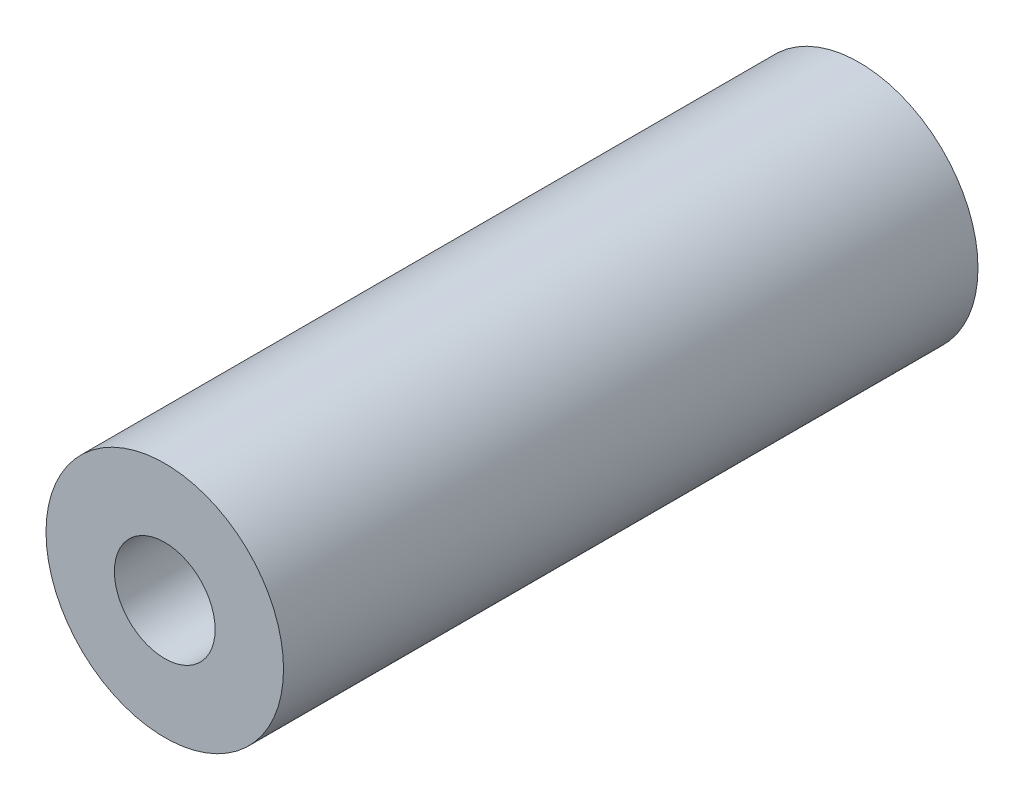
ISO-10303-21;
HEADER;
FILE_DESCRIPTION(('STEP AP214'),'2;1');
FILE_NAME('part.step','',(''),(''),'','','');
FILE_SCHEMA(('AUTOMOTIVE_DESIGN { 1 0 10303 214 1 1 1 1 }'));
ENDSEC;
DATA;
#1=APPLICATION_CONTEXT('core data for automotive mechanical design processes');
#2=APPLICATION_PROTOCOL_DEFINITION('international standard','automotive_design',2000,#1);
#3=PRODUCT_CONTEXT('',#1,'mechanical');
#4=PRODUCT('Part','Part','',(#3));
#5=PRODUCT_RELATED_PRODUCT_CATEGORY('part','',(#4));
#6=PRODUCT_DEFINITION_FORMATION('','',#4);
#7=PRODUCT_DEFINITION_CONTEXT('part definition',#1,'design');
#8=PRODUCT_DEFINITION('design','',#6,#7);
#9=PRODUCT_DEFINITION_SHAPE('','',#8);
#10=(LENGTH_UNIT() NAMED_UNIT(*) SI_UNIT(.MILLI.,.METRE.));
#11=(NAMED_UNIT(*) PLANE_ANGLE_UNIT() SI_UNIT($,.RADIAN.));
#12=(NAMED_UNIT(*) SI_UNIT($,.STERADIAN.) SOLID_ANGLE_UNIT());
#13=UNCERTAINTY_MEASURE_WITH_UNIT(LENGTH_MEASURE(1.E-05),#10,'distance_accuracy_value','');
#14=(GEOMETRIC_REPRESENTATION_CONTEXT(3) GLOBAL_UNCERTAINTY_ASSIGNED_CONTEXT((#13)) GLOBAL_UNIT_ASSIGNED_CONTEXT((#10,
#11,#12)) REPRESENTATION_CONTEXT('',''));
#15=CARTESIAN_POINT('',(0.,0.,0.));
#16=DIRECTION('',(0.,0.,1.));
#17=DIRECTION('',(1.,0.,0.));
#18=AXIS2_PLACEMENT_3D('',#15,#16,#17);
#19=CARTESIAN_POINT('',(0.,0.,13.924799938));
#20=DIRECTION('',(0.,0.,-1.));
#21=DIRECTION('',(-1.,0.,0.));
#22=AXIS2_PLACEMENT_3D('',#19,#20,#21);
#23=CYLINDRICAL_SURFACE('',#22,4.7625);
#24=CARTESIAN_POINT('',(0.,0.,13.924799938));
#25=DIRECTION('',(0.,0.,1.));
#26=DIRECTION('',(1.,0.,0.));
#27=AXIS2_PLACEMENT_3D('',#24,#25,#26);
#28=CIRCLE('',#27,4.7625);
#29=CARTESIAN_POINT('',(-4.7625,0.,13.924799938));
#30=VERTEX_POINT('',#29);
#31=EDGE_CURVE('E10',#30,#30,#28,.T.);
#32=CARTESIAN_POINT('',(0.,0.,-13.924799938));
#33=DIRECTION('',(0.,0.,1.));
#34=DIRECTION('',(1.,0.,0.));
#35=AXIS2_PLACEMENT_3D('',#32,#33,#34);
#36=CIRCLE('',#35,4.7625);
#37=CARTESIAN_POINT('',(-4.7625,0.,-13.924799938));
#38=VERTEX_POINT('',#37);
#39=EDGE_CURVE('E50',#38,#38,#36,.T.);
#40=CARTESIAN_POINT('',(-4.7625,0.,13.924799938));
#41=CARTESIAN_POINT('',(-4.7625,0.,13.6346999392917));
#42=CARTESIAN_POINT('',(-4.7625,0.,13.3445999405833));
#43=CARTESIAN_POINT('',(-4.7625,0.,12.7643999431667));
#44=CARTESIAN_POINT('',(-4.7625,0.,12.4742999444583));
#45=CARTESIAN_POINT('',(-4.7625,0.,11.8940999470417));
#46=CARTESIAN_POINT('',(-4.7625,0.,11.6039999483333));
#47=CARTESIAN_POINT('',(-4.7625,0.,11.0237999509167));
#48=CARTESIAN_POINT('',(-4.7625,0.,10.7336999522083));
#49=CARTESIAN_POINT('',(-4.7625,0.,10.1534999547917));
#50=CARTESIAN_POINT('',(-4.7625,0.,9.86339995608333));
#51=CARTESIAN_POINT('',(-4.7625,0.,9.28319995866667));
#52=CARTESIAN_POINT('',(-4.7625,0.,8.99309995995833));
#53=CARTESIAN_POINT('',(-4.7625,0.,8.41289996254166));
#54=CARTESIAN_POINT('',(-4.7625,0.,8.12279996383333));
#55=CARTESIAN_POINT('',(-4.7625,0.,7.54259996641666));
#56=CARTESIAN_POINT('',(-4.7625,0.,7.25249996770833));
#57=CARTESIAN_POINT('',(-4.7625,0.,6.67229997029167));
#58=CARTESIAN_POINT('',(-4.7625,0.,6.38219997158333));
#59=CARTESIAN_POINT('',(-4.7625,0.,5.80199997416667));
#60=CARTESIAN_POINT('',(-4.7625,0.,5.51189997545833));
#61=CARTESIAN_POINT('',(-4.7625,0.,4.93169997804167));
#62=CARTESIAN_POINT('',(-4.7625,0.,4.64159997933333));
#63=CARTESIAN_POINT('',(-4.7625,0.,4.06139998191667));
#64=CARTESIAN_POINT('',(-4.7625,0.,3.77129998320833));
#65=CARTESIAN_POINT('',(-4.7625,0.,3.19109998579166));
#66=CARTESIAN_POINT('',(-4.7625,0.,2.90099998708333));
#67=CARTESIAN_POINT('',(-4.7625,0.,2.32079998966666));
#68=CARTESIAN_POINT('',(-4.7625,0.,2.03069999095833));
#69=CARTESIAN_POINT('',(-4.7625,0.,1.45049999354166));
#70=CARTESIAN_POINT('',(-4.7625,0.,1.16039999483333));
#71=CARTESIAN_POINT('',(-4.7625,0.,0.580199997416665));
#72=CARTESIAN_POINT('',(-4.7625,0.,0.290099998708332));
#73=CARTESIAN_POINT('',(-4.7625,0.,-0.290099998708335));
#74=CARTESIAN_POINT('',(-4.7625,0.,-0.580199997416668));
#75=CARTESIAN_POINT('',(-4.7625,0.,-1.16039999483333));
#76=CARTESIAN_POINT('',(-4.7625,0.,-1.45049999354167));
#77=CARTESIAN_POINT('',(-4.7625,0.,-2.03069999095833));
#78=CARTESIAN_POINT('',(-4.7625,0.,-2.32079998966667));
#79=CARTESIAN_POINT('',(-4.7625,0.,-2.90099998708333));
#80=CARTESIAN_POINT('',(-4.7625,0.,-3.19109998579167));
#81=CARTESIAN_POINT('',(-4.7625,0.,-3.77129998320833));
#82=CARTESIAN_POINT('',(-4.7625,0.,-4.06139998191667));
#83=CARTESIAN_POINT('',(-4.7625,0.,-4.64159997933333));
#84=CARTESIAN_POINT('',(-4.7625,0.,-4.93169997804167));
#85=CARTESIAN_POINT('',(-4.7625,0.,-5.51189997545833));
#86=CARTESIAN_POINT('',(-4.7625,0.,-5.80199997416667));
#87=CARTESIAN_POINT('',(-4.7625,0.,-6.38219997158333));
#88=CARTESIAN_POINT('',(-4.7625,0.,-6.67229997029167));
#89=CARTESIAN_POINT('',(-4.7625,0.,-7.25249996770834));
#90=CARTESIAN_POINT('',(-4.7625,0.,-7.54259996641667));
#91=CARTESIAN_POINT('',(-4.7625,0.,-8.12279996383334));
#92=CARTESIAN_POINT('',(-4.7625,0.,-8.41289996254167));
#93=CARTESIAN_POINT('',(-4.7625,0.,-8.99309995995834));
#94=CARTESIAN_POINT('',(-4.7625,0.,-9.28319995866667));
#95=CARTESIAN_POINT('',(-4.7625,0.,-9.86339995608334));
#96=CARTESIAN_POINT('',(-4.7625,0.,-10.1534999547917));
#97=CARTESIAN_POINT('',(-4.7625,0.,-10.7336999522083));
#98=CARTESIAN_POINT('',(-4.7625,0.,-11.0237999509167));
#99=CARTESIAN_POINT('',(-4.7625,0.,-11.6039999483333));
#100=CARTESIAN_POINT('',(-4.7625,0.,-11.8940999470417));
#101=CARTESIAN_POINT('',(-4.7625,0.,-12.4742999444583));
#102=CARTESIAN_POINT('',(-4.7625,0.,-12.7643999431667));
#103=CARTESIAN_POINT('',(-4.7625,0.,-13.3445999405833));
#104=CARTESIAN_POINT('',(-4.7625,0.,-13.6346999392917));
#105=CARTESIAN_POINT('',(-4.7625,0.,-13.924799938));
#106=B_SPLINE_CURVE_WITH_KNOTS('',3,(#40,#41,#42,#43,#44,#45,#46,#47,#48,#49,#50,#51,#52,#53,
#54,#55,#56,#57,#58,#59,#60,#61,#62,#63,#64,#65,#66,#67,#68,#69,#70,#71,#72,#73,#74,#75,#76,#77,
#78,#79,#80,#81,#82,#83,#84,#85,#86,#87,#88,#89,#90,#91,#92,#93,#94,#95,#96,#97,#98,#99,#100,
#101,#102,#103,#104,#105),.UNSPECIFIED.,.F.,.F.,(4,2,2,2,2,2,2,2,2,2,2,2,2,2,2,2,2,2,2,2,2,2,2,
2,2,2,2,2,2,2,2,2,4),(0.,0.870299996125002,1.74059999225,2.610899988375,3.4811999845,
4.351499980625,5.22179997675,6.092099972875,6.962399969,7.832699965125,8.70299996125,
9.573299957375,10.4435999535,11.313899949625,12.18419994575,13.054499941875,13.924799938,
14.795099934125,15.66539993025,16.535699926375,17.4059999225,18.276299918625,19.14659991475,
20.016899910875,20.887199907,21.757499903125,22.62779989925,23.498099895375,24.3683998915,
25.238699887625,26.10899988375,26.979299879875,27.849599876),.UNSPECIFIED.);
#107=EDGE_CURVE('BSEAM47',#30,#38,#106,.T.);
#108=ORIENTED_EDGE('',*,*,#31,.F.);
#109=ORIENTED_EDGE('',*,*,#39,.T.);
#110=ORIENTED_EDGE('',*,*,#107,.T.);
#111=ORIENTED_EDGE('',*,*,#107,.F.);
#112=EDGE_LOOP('',(#108,#110,#109,#111));
#113=FACE_BOUND('',#112,.T.);
#114=ADVANCED_FACE('F47',(#113),#23,.T.);
#115=CARTESIAN_POINT('',(0.,0.,13.924799938));
#116=DIRECTION('',(0.,0.,1.));
#117=DIRECTION('',(1.,0.,0.));
#118=AXIS2_PLACEMENT_3D('',#115,#116,#117);
#119=PLANE('',#118);
#120=CARTESIAN_POINT('',(0.,0.,13.924799938));
#121=DIRECTION('',(0.,0.,1.));
#122=DIRECTION('',(1.,0.,0.));
#123=AXIS2_PLACEMENT_3D('',#120,#121,#122);
#124=CIRCLE('',#123,2.01929999999999);
#125=CARTESIAN_POINT('',(2.01929999999999,0.,13.924799938));
#126=VERTEX_POINT('',#125);
#127=EDGE_CURVE('E64',#126,#126,#124,.T.);
#128=ORIENTED_EDGE('',*,*,#127,.F.);
#129=EDGE_LOOP('',(#128));
#130=FACE_BOUND('',#129,.T.);
#131=ORIENTED_EDGE('',*,*,#31,.T.);
#132=EDGE_LOOP('',(#131));
#133=FACE_BOUND('',#132,.T.);
#134=ADVANCED_FACE('F71',(#130,#133),#119,.T.);
#135=CARTESIAN_POINT('',(0.,0.,-13.924799938));
#136=DIRECTION('',(0.,0.,1.));
#137=DIRECTION('',(1.,0.,0.));
#138=AXIS2_PLACEMENT_3D('',#135,#136,#137);
#139=PLANE('',#138);
#140=CARTESIAN_POINT('',(0.,0.,-13.924799938));
#141=DIRECTION('',(0.,0.,-1.));
#142=DIRECTION('',(-1.,0.,0.));
#143=AXIS2_PLACEMENT_3D('',#140,#141,#142);
#144=CIRCLE('',#143,2.01929999999999);
#145=CARTESIAN_POINT('',(-2.01929999999999,0.,-13.924799938));
#146=VERTEX_POINT('',#145);
#147=EDGE_CURVE('E59',#146,#146,#144,.T.);
#148=ORIENTED_EDGE('',*,*,#147,.F.);
#149=EDGE_LOOP('',(#148));
#150=FACE_BOUND('',#149,.T.);
#151=ORIENTED_EDGE('',*,*,#39,.F.);
#152=EDGE_LOOP('',(#151));
#153=FACE_BOUND('',#152,.T.);
#154=ADVANCED_FACE('F73',(#150,#153),#139,.F.);
#155=CARTESIAN_POINT('',(0.,0.,-13.924799938));
#156=DIRECTION('',(0.,0.,-1.));
#157=DIRECTION('',(-1.,0.,0.));
#158=AXIS2_PLACEMENT_3D('',#155,#156,#157);
#159=CYLINDRICAL_SURFACE('',#158,2.01929999999999);
#160=ORIENTED_EDGE('',*,*,#147,.T.);
#161=EDGE_LOOP('',(#160));
#162=FACE_BOUND('',#161,.T.);
#163=ORIENTED_EDGE('',*,*,#127,.T.);
#164=EDGE_LOOP('',(#163));
#165=FACE_BOUND('',#164,.T.);
#166=ADVANCED_FACE('F69',(#162,#165),#159,.F.);
#167=CLOSED_SHELL('',(#114,#134,#154,#166));
#168=MANIFOLD_SOLID_BREP('B2',#167);
#169=ADVANCED_BREP_SHAPE_REPRESENTATION('',(#18,#168),#14);
#170=SHAPE_DEFINITION_REPRESENTATION(#9,#169);
ENDSEC;
END-ISO-10303-21;
